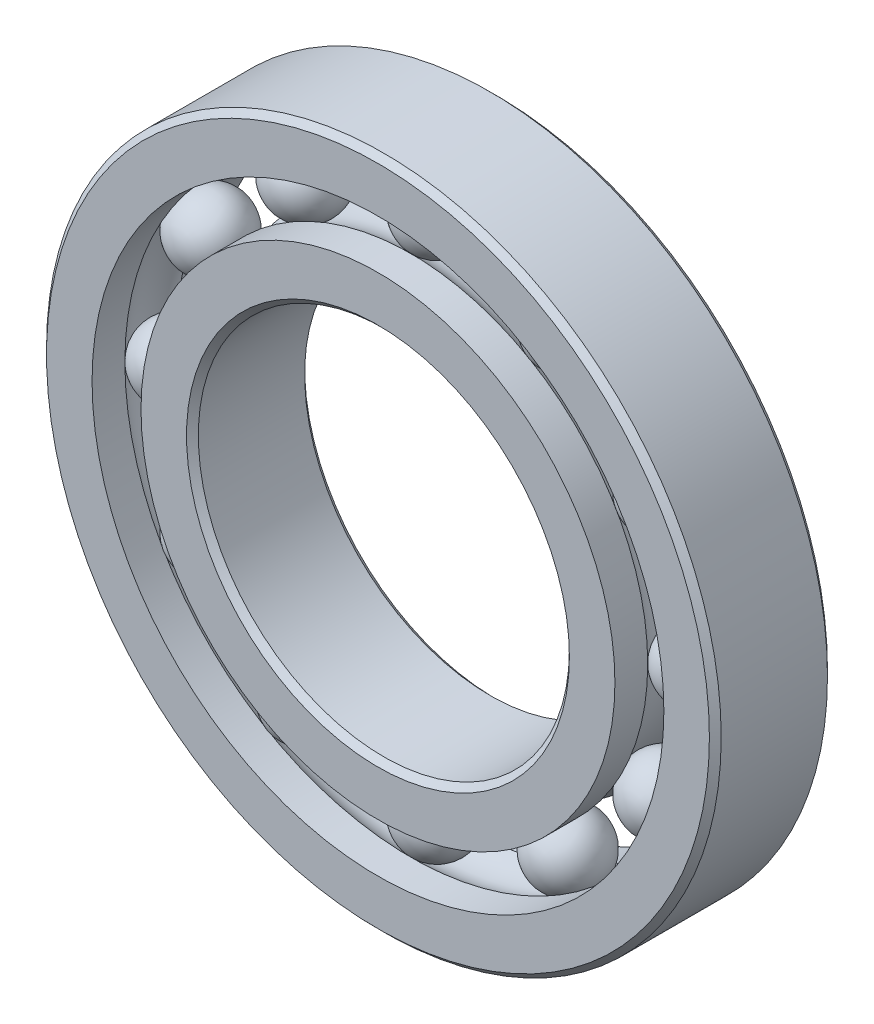
ISO-10303-21;
HEADER;
FILE_DESCRIPTION(('STEP AP214'),'2;1');
FILE_NAME('part.step','',(''),(''),'','','');
FILE_SCHEMA(('AUTOMOTIVE_DESIGN { 1 0 10303 214 1 1 1 1 }'));
ENDSEC;
DATA;
#1=APPLICATION_CONTEXT('core data for automotive mechanical design processes');
#2=APPLICATION_PROTOCOL_DEFINITION('international standard','automotive_design',2000,#1);
#3=PRODUCT_CONTEXT('',#1,'mechanical');
#4=PRODUCT('Part','Part','',(#3));
#5=PRODUCT_RELATED_PRODUCT_CATEGORY('part','',(#4));
#6=PRODUCT_DEFINITION_FORMATION('','',#4);
#7=PRODUCT_DEFINITION_CONTEXT('part definition',#1,'design');
#8=PRODUCT_DEFINITION('design','',#6,#7);
#9=PRODUCT_DEFINITION_SHAPE('','',#8);
#10=(LENGTH_UNIT() NAMED_UNIT(*) SI_UNIT(.MILLI.,.METRE.));
#11=(NAMED_UNIT(*) PLANE_ANGLE_UNIT() SI_UNIT($,.RADIAN.));
#12=(NAMED_UNIT(*) SI_UNIT($,.STERADIAN.) SOLID_ANGLE_UNIT());
#13=UNCERTAINTY_MEASURE_WITH_UNIT(LENGTH_MEASURE(1.E-05),#10,'distance_accuracy_value','');
#14=(GEOMETRIC_REPRESENTATION_CONTEXT(3) GLOBAL_UNCERTAINTY_ASSIGNED_CONTEXT((#13)) GLOBAL_UNIT_ASSIGNED_CONTEXT((#10,
#11,#12)) REPRESENTATION_CONTEXT('',''));
#15=CARTESIAN_POINT('',(0.,0.,0.));
#16=DIRECTION('',(0.,0.,1.));
#17=DIRECTION('',(1.,0.,0.));
#18=AXIS2_PLACEMENT_3D('',#15,#16,#17);
#19=CARTESIAN_POINT('',(-12.3031249999997,21.309637591871,0.));
#20=DIRECTION('',(0.,0.,1.));
#21=DIRECTION('',(-0.499999999999989,0.866025403784445,0.));
#22=AXIS2_PLACEMENT_3D('',#19,#20,#21);
#23=SPHERICAL_SURFACE('',#22,3.37650718557395);
#24=CARTESIAN_POINT('',(-12.3031249999997,21.309637591871,3.37650718557395));
#25=VERTEX_POINT('',#24);
#26=VERTEX_LOOP('',#25);
#27=FACE_BOUND('',#26,.T.);
#28=ADVANCED_FACE('F45',(#27),#23,.T.);
#29=CLOSED_SHELL('',(#28));
#30=MANIFOLD_SOLID_BREP('B2',#29);
#31=CARTESIAN_POINT('',(-21.3096375918707,12.3031250000002,0.));
#32=DIRECTION('',(0.,0.,1.));
#33=DIRECTION('',(-0.866025403784433,0.50000000000001,0.));
#34=AXIS2_PLACEMENT_3D('',#31,#32,#33);
#35=SPHERICAL_SURFACE('',#34,3.37650718557395);
#36=CARTESIAN_POINT('',(-21.3096375918707,12.3031250000002,3.37650718557395));
#37=VERTEX_POINT('',#36);
#38=VERTEX_LOOP('',#37);
#39=FACE_BOUND('',#38,.T.);
#40=ADVANCED_FACE('F67',(#39),#35,.T.);
#41=CLOSED_SHELL('',(#40));
#42=MANIFOLD_SOLID_BREP('B6',#41);
#43=CARTESIAN_POINT('',(-24.60625,2.57736788081727E-13,0.));
#44=DIRECTION('',(0.,0.,1.));
#45=DIRECTION('',(-1.,0.,0.));
#46=AXIS2_PLACEMENT_3D('',#43,#44,#45);
#47=SPHERICAL_SURFACE('',#46,3.37650718557395);
#48=CARTESIAN_POINT('',(-24.60625,2.57736788081727E-13,3.37650718557395));
#49=VERTEX_POINT('',#48);
#50=VERTEX_LOOP('',#49);
#51=FACE_BOUND('',#50,.T.);
#52=ADVANCED_FACE('F89',(#51),#47,.T.);
#53=CLOSED_SHELL('',(#52));
#54=MANIFOLD_SOLID_BREP('B41',#53);
#55=CARTESIAN_POINT('',(-21.309637591871,-12.3031249999998,0.));
#56=DIRECTION('',(0.,0.,1.));
#57=DIRECTION('',(-0.866025403784443,-0.499999999999992,0.));
#58=AXIS2_PLACEMENT_3D('',#55,#56,#57);
#59=SPHERICAL_SURFACE('',#58,3.37650718557395);
#60=CARTESIAN_POINT('',(-21.309637591871,-12.3031249999998,3.37650718557395));
#61=VERTEX_POINT('',#60);
#62=VERTEX_LOOP('',#61);
#63=FACE_BOUND('',#62,.T.);
#64=ADVANCED_FACE('F111',(#63),#59,.T.);
#65=CLOSED_SHELL('',(#64));
#66=MANIFOLD_SOLID_BREP('B63',#65);
#67=CARTESIAN_POINT('',(-12.3031250000002,-21.3096375918707,0.));
#68=DIRECTION('',(0.,0.,1.));
#69=DIRECTION('',(-0.500000000000007,-0.866025403784435,0.));
#70=AXIS2_PLACEMENT_3D('',#67,#68,#69);
#71=SPHERICAL_SURFACE('',#70,3.37650718557395);
#72=CARTESIAN_POINT('',(-12.3031250000002,-21.3096375918707,3.37650718557395));
#73=VERTEX_POINT('',#72);
#74=VERTEX_LOOP('',#73);
#75=FACE_BOUND('',#74,.T.);
#76=ADVANCED_FACE('F133',(#75),#71,.T.);
#77=CLOSED_SHELL('',(#76));
#78=MANIFOLD_SOLID_BREP('B85',#77);
#79=CARTESIAN_POINT('',(-1.71824525387818E-13,-24.60625,0.));
#80=DIRECTION('',(0.,0.,1.));
#81=DIRECTION('',(0.,-1.,0.));
#82=AXIS2_PLACEMENT_3D('',#79,#80,#81);
#83=SPHERICAL_SURFACE('',#82,3.37650718557395);
#84=CARTESIAN_POINT('',(-1.71824525387818E-13,-24.60625,3.37650718557395));
#85=VERTEX_POINT('',#84);
#86=VERTEX_LOOP('',#85);
#87=FACE_BOUND('',#86,.T.);
#88=ADVANCED_FACE('F155',(#87),#83,.T.);
#89=CLOSED_SHELL('',(#88));
#90=MANIFOLD_SOLID_BREP('B107',#89);
#91=CARTESIAN_POINT('',(12.3031249999999,-21.3096375918709,0.));
#92=DIRECTION('',(0.,0.,1.));
#93=DIRECTION('',(0.499999999999995,-0.866025403784442,0.));
#94=AXIS2_PLACEMENT_3D('',#91,#92,#93);
#95=SPHERICAL_SURFACE('',#94,3.37650718557395);
#96=CARTESIAN_POINT('',(12.3031249999999,-21.3096375918709,3.37650718557395));
#97=VERTEX_POINT('',#96);
#98=VERTEX_LOOP('',#97);
#99=FACE_BOUND('',#98,.T.);
#100=ADVANCED_FACE('F177',(#99),#95,.T.);
#101=CLOSED_SHELL('',(#100));
#102=MANIFOLD_SOLID_BREP('B129',#101);
#103=CARTESIAN_POINT('',(21.3096375918708,-12.3031250000001,0.));
#104=DIRECTION('',(0.,0.,1.));
#105=DIRECTION('',(0.866025403784436,-0.500000000000004,0.));
#106=AXIS2_PLACEMENT_3D('',#103,#104,#105);
#107=SPHERICAL_SURFACE('',#106,3.37650718557395);
#108=CARTESIAN_POINT('',(21.3096375918708,-12.3031250000001,3.37650718557395));
#109=VERTEX_POINT('',#108);
#110=VERTEX_LOOP('',#109);
#111=FACE_BOUND('',#110,.T.);
#112=ADVANCED_FACE('F199',(#111),#107,.T.);
#113=CLOSED_SHELL('',(#112));
#114=MANIFOLD_SOLID_BREP('B151',#113);
#115=CARTESIAN_POINT('',(24.60625,0.,0.));
#116=DIRECTION('',(0.,0.,1.));
#117=DIRECTION('',(1.,0.,0.));
#118=AXIS2_PLACEMENT_3D('',#115,#116,#117);
#119=SPHERICAL_SURFACE('',#118,3.37650718557395);
#120=CARTESIAN_POINT('',(24.60625,0.,3.37650718557395));
#121=VERTEX_POINT('',#120);
#122=VERTEX_LOOP('',#121);
#123=FACE_BOUND('',#122,.T.);
#124=ADVANCED_FACE('F221',(#123),#119,.T.);
#125=CLOSED_SHELL('',(#124));
#126=MANIFOLD_SOLID_BREP('B173',#125);
#127=CARTESIAN_POINT('',(21.3096375918709,12.303125,0.));
#128=DIRECTION('',(0.,0.,1.));
#129=DIRECTION('',(0.86602540378444,0.499999999999998,0.));
#130=AXIS2_PLACEMENT_3D('',#127,#128,#129);
#131=SPHERICAL_SURFACE('',#130,3.37650718557395);
#132=CARTESIAN_POINT('',(21.3096375918709,12.303125,3.37650718557395));
#133=VERTEX_POINT('',#132);
#134=VERTEX_LOOP('',#133);
#135=FACE_BOUND('',#134,.T.);
#136=ADVANCED_FACE('F243',(#135),#131,.T.);
#137=CLOSED_SHELL('',(#136));
#138=MANIFOLD_SOLID_BREP('B195',#137);
#139=CARTESIAN_POINT('',(12.303125,21.3096375918708,0.));
#140=DIRECTION('',(0.,0.,1.));
#141=DIRECTION('',(0.500000000000001,0.866025403784438,0.));
#142=AXIS2_PLACEMENT_3D('',#139,#140,#141);
#143=SPHERICAL_SURFACE('',#142,3.37650718557395);
#144=CARTESIAN_POINT('',(12.303125,21.3096375918708,3.37650718557395));
#145=VERTEX_POINT('',#144);
#146=VERTEX_LOOP('',#145);
#147=FACE_BOUND('',#146,.T.);
#148=ADVANCED_FACE('F265',(#147),#143,.T.);
#149=CLOSED_SHELL('',(#148));
#150=MANIFOLD_SOLID_BREP('B217',#149);
#151=CARTESIAN_POINT('',(0.,24.60625,0.));
#152=DIRECTION('',(0.,0.,1.));
#153=DIRECTION('',(0.,1.,0.));
#154=AXIS2_PLACEMENT_3D('',#151,#152,#153);
#155=SPHERICAL_SURFACE('',#154,3.37650718557395);
#156=CARTESIAN_POINT('',(0.,24.60625,3.37650718557395));
#157=VERTEX_POINT('',#156);
#158=VERTEX_LOOP('',#157);
#159=FACE_BOUND('',#158,.T.);
#160=ADVANCED_FACE('F289',(#159),#155,.T.);
#161=CLOSED_SHELL('',(#160));
#162=MANIFOLD_SOLID_BREP('B239',#161);
#163=CARTESIAN_POINT('',(0.,22.3035027472528,5.55625));
#164=DIRECTION('',(0.,0.,-1.));
#165=DIRECTION('',(-1.,0.,0.));
#166=AXIS2_PLACEMENT_3D('',#163,#164,#165);
#167=PLANE('',#166);
#168=CARTESIAN_POINT('',(0.,0.,5.55625));
#169=DIRECTION('',(0.,0.,1.));
#170=DIRECTION('',(1.,0.,0.));
#171=AXIS2_PLACEMENT_3D('',#168,#169,#170);
#172=CIRCLE('',#171,18.018125);
#173=CARTESIAN_POINT('',(18.018125,0.,5.55625));
#174=VERTEX_POINT('',#173);
#175=EDGE_CURVE('E338',#174,#174,#172,.T.);
#176=ORIENTED_EDGE('',*,*,#175,.F.);
#177=EDGE_LOOP('',(#176));
#178=FACE_BOUND('',#177,.T.);
#179=CARTESIAN_POINT('',(0.,0.,5.55625000000001));
#180=DIRECTION('',(0.,0.,1.));
#181=DIRECTION('',(1.,0.,0.));
#182=AXIS2_PLACEMENT_3D('',#179,#180,#181);
#183=CIRCLE('',#182,22.3035027472528);
#184=CARTESIAN_POINT('',(22.3035027472528,0.,5.55625000000001));
#185=VERTEX_POINT('',#184);
#186=EDGE_CURVE('E288',#185,#185,#183,.T.);
#187=ORIENTED_EDGE('',*,*,#186,.T.);
#188=EDGE_LOOP('',(#187));
#189=FACE_BOUND('',#188,.T.);
#190=ADVANCED_FACE('F310',(#178,#189),#167,.F.);
#191=CARTESIAN_POINT('',(0.,0.,5.55625));
#192=DIRECTION('',(0.,0.,1.));
#193=DIRECTION('',(1.,0.,0.));
#194=AXIS2_PLACEMENT_3D('',#191,#192,#193);
#195=CYLINDRICAL_SURFACE('',#194,22.3035027472528);
#196=ORIENTED_EDGE('',*,*,#186,.F.);
#197=EDGE_LOOP('',(#196));
#198=FACE_BOUND('',#197,.T.);
#199=CARTESIAN_POINT('',(0.,0.,2.46944444444444));
#200=DIRECTION('',(0.,0.,1.));
#201=DIRECTION('',(1.,0.,0.));
#202=AXIS2_PLACEMENT_3D('',#199,#200,#201);
#203=CIRCLE('',#202,22.3035027472528);
#204=CARTESIAN_POINT('',(22.3035027472528,0.,2.46944444444444));
#205=VERTEX_POINT('',#204);
#206=EDGE_CURVE('E316',#205,#205,#203,.T.);
#207=ORIENTED_EDGE('',*,*,#206,.T.);
#208=EDGE_LOOP('',(#207));
#209=FACE_BOUND('',#208,.T.);
#210=ADVANCED_FACE('F345',(#198,#209),#195,.T.);
#211=CARTESIAN_POINT('',(0.,0.,0.));
#212=DIRECTION('',(0.,0.,1.));
#213=DIRECTION('',(1.,0.,0.));
#214=AXIS2_PLACEMENT_3D('',#211,#212,#213);
#215=TOROIDAL_SURFACE('',#214,24.60625,3.37650718557395);
#216=ORIENTED_EDGE('',*,*,#206,.F.);
#217=EDGE_LOOP('',(#216));
#218=FACE_BOUND('',#217,.T.);
#219=CARTESIAN_POINT('',(0.,0.,-2.46944444444445));
#220=DIRECTION('',(0.,0.,1.));
#221=DIRECTION('',(1.,0.,0.));
#222=AXIS2_PLACEMENT_3D('',#219,#220,#221);
#223=CIRCLE('',#222,22.3035027472528);
#224=CARTESIAN_POINT('',(22.3035027472528,0.,-2.46944444444445));
#225=VERTEX_POINT('',#224);
#226=EDGE_CURVE('E320',#225,#225,#223,.T.);
#227=ORIENTED_EDGE('',*,*,#226,.T.);
#228=EDGE_LOOP('',(#227));
#229=FACE_BOUND('',#228,.T.);
#230=ADVANCED_FACE('F349',(#218,#229),#215,.F.);
#231=CARTESIAN_POINT('',(0.,0.,5.55625));
#232=DIRECTION('',(0.,0.,1.));
#233=DIRECTION('',(1.,0.,0.));
#234=AXIS2_PLACEMENT_3D('',#231,#232,#233);
#235=CYLINDRICAL_SURFACE('',#234,22.3035027472528);
#236=ORIENTED_EDGE('',*,*,#226,.F.);
#237=EDGE_LOOP('',(#236));
#238=FACE_BOUND('',#237,.T.);
#239=CARTESIAN_POINT('',(0.,0.,-5.55625));
#240=DIRECTION('',(0.,0.,1.));
#241=DIRECTION('',(1.,0.,0.));
#242=AXIS2_PLACEMENT_3D('',#239,#240,#241);
#243=CIRCLE('',#242,22.3035027472528);
#244=CARTESIAN_POINT('',(22.3035027472528,0.,-5.55625));
#245=VERTEX_POINT('',#244);
#246=EDGE_CURVE('E324',#245,#245,#243,.T.);
#247=ORIENTED_EDGE('',*,*,#246,.T.);
#248=EDGE_LOOP('',(#247));
#249=FACE_BOUND('',#248,.T.);
#250=ADVANCED_FACE('F354',(#238,#249),#235,.T.);
#251=CARTESIAN_POINT('',(0.,18.018125,-5.55625000000001));
#252=DIRECTION('',(0.,0.,1.));
#253=DIRECTION('',(1.,0.,0.));
#254=AXIS2_PLACEMENT_3D('',#251,#252,#253);
#255=PLANE('',#254);
#256=ORIENTED_EDGE('',*,*,#246,.F.);
#257=EDGE_LOOP('',(#256));
#258=FACE_BOUND('',#257,.T.);
#259=CARTESIAN_POINT('',(0.,0.,-5.55625));
#260=DIRECTION('',(0.,0.,1.));
#261=DIRECTION('',(1.,0.,0.));
#262=AXIS2_PLACEMENT_3D('',#259,#260,#261);
#263=CIRCLE('',#262,18.018125);
#264=CARTESIAN_POINT('',(18.018125,0.,-5.55625));
#265=VERTEX_POINT('',#264);
#266=EDGE_CURVE('E329',#265,#265,#263,.T.);
#267=ORIENTED_EDGE('',*,*,#266,.T.);
#268=EDGE_LOOP('',(#267));
#269=FACE_BOUND('',#268,.T.);
#270=ADVANCED_FACE('F360',(#258,#269),#255,.F.);
#271=CARTESIAN_POINT('',(0.,0.,-5.000625));
#272=DIRECTION('',(0.,0.,-1.));
#273=DIRECTION('',(-1.,0.,0.));
#274=AXIS2_PLACEMENT_3D('',#271,#272,#273);
#275=CONICAL_SURFACE('',#274,17.4625,0.785398163397445);
#276=ORIENTED_EDGE('',*,*,#266,.F.);
#277=EDGE_LOOP('',(#276));
#278=FACE_BOUND('',#277,.T.);
#279=CARTESIAN_POINT('',(0.,0.,-5.000625));
#280=DIRECTION('',(0.,0.,1.));
#281=DIRECTION('',(1.,0.,0.));
#282=AXIS2_PLACEMENT_3D('',#279,#280,#281);
#283=CIRCLE('',#282,17.4625);
#284=CARTESIAN_POINT('',(17.4625,0.,-5.000625));
#285=VERTEX_POINT('',#284);
#286=EDGE_CURVE('E332',#285,#285,#283,.T.);
#287=ORIENTED_EDGE('',*,*,#286,.T.);
#288=EDGE_LOOP('',(#287));
#289=FACE_BOUND('',#288,.T.);
#290=ADVANCED_FACE('F364',(#278,#289),#275,.F.);
#291=CARTESIAN_POINT('',(0.,0.,5.55625));
#292=DIRECTION('',(0.,0.,1.));
#293=DIRECTION('',(1.,0.,0.));
#294=AXIS2_PLACEMENT_3D('',#291,#292,#293);
#295=CYLINDRICAL_SURFACE('',#294,17.4625);
#296=ORIENTED_EDGE('',*,*,#286,.F.);
#297=EDGE_LOOP('',(#296));
#298=FACE_BOUND('',#297,.T.);
#299=CARTESIAN_POINT('',(0.,0.,5.000625));
#300=DIRECTION('',(0.,0.,1.));
#301=DIRECTION('',(1.,0.,0.));
#302=AXIS2_PLACEMENT_3D('',#299,#300,#301);
#303=CIRCLE('',#302,17.4625);
#304=CARTESIAN_POINT('',(17.4625,0.,5.000625));
#305=VERTEX_POINT('',#304);
#306=EDGE_CURVE('E335',#305,#305,#303,.T.);
#307=ORIENTED_EDGE('',*,*,#306,.T.);
#308=EDGE_LOOP('',(#307));
#309=FACE_BOUND('',#308,.T.);
#310=ADVANCED_FACE('F368',(#298,#309),#295,.F.);
#311=CARTESIAN_POINT('',(0.,0.,5.55625));
#312=DIRECTION('',(0.,0.,1.));
#313=DIRECTION('',(1.,0.,0.));
#314=AXIS2_PLACEMENT_3D('',#311,#312,#313);
#315=CONICAL_SURFACE('',#314,18.018125,0.78539816339745);
#316=ORIENTED_EDGE('',*,*,#306,.F.);
#317=EDGE_LOOP('',(#316));
#318=FACE_BOUND('',#317,.T.);
#319=ORIENTED_EDGE('',*,*,#175,.T.);
#320=EDGE_LOOP('',(#319));
#321=FACE_BOUND('',#320,.T.);
#322=ADVANCED_FACE('F342',(#318,#321),#315,.F.);
#323=CLOSED_SHELL('',(#190,#210,#230,#250,#270,#290,#310,#322));
#324=MANIFOLD_SOLID_BREP('B261',#323);
#325=CARTESIAN_POINT('',(0.,0.,5.000625));
#326=DIRECTION('',(0.,0.,-1.));
#327=DIRECTION('',(-1.,0.,0.));
#328=AXIS2_PLACEMENT_3D('',#325,#326,#327);
#329=CONICAL_SURFACE('',#328,31.75,0.785398163397446);
#330=CARTESIAN_POINT('',(0.,0.,5.55625));
#331=DIRECTION('',(0.,0.,1.));
#332=DIRECTION('',(1.,0.,0.));
#333=AXIS2_PLACEMENT_3D('',#330,#331,#332);
#334=CIRCLE('',#333,31.194375);
#335=CARTESIAN_POINT('',(31.194375,0.,5.55625));
#336=VERTEX_POINT('',#335);
#337=EDGE_CURVE('E482',#336,#336,#334,.T.);
#338=ORIENTED_EDGE('',*,*,#337,.F.);
#339=EDGE_LOOP('',(#338));
#340=FACE_BOUND('',#339,.T.);
#341=CARTESIAN_POINT('',(0.,0.,5.000625));
#342=DIRECTION('',(0.,0.,1.));
#343=DIRECTION('',(1.,0.,0.));
#344=AXIS2_PLACEMENT_3D('',#341,#342,#343);
#345=CIRCLE('',#344,31.75);
#346=CARTESIAN_POINT('',(31.75,0.,5.000625));
#347=VERTEX_POINT('',#346);
#348=EDGE_CURVE('E309',#347,#347,#345,.T.);
#349=ORIENTED_EDGE('',*,*,#348,.T.);
#350=EDGE_LOOP('',(#349));
#351=FACE_BOUND('',#350,.T.);
#352=ADVANCED_FACE('F447',(#340,#351),#329,.T.);
#353=CARTESIAN_POINT('',(0.,0.,5.55625));
#354=DIRECTION('',(0.,0.,1.));
#355=DIRECTION('',(1.,0.,0.));
#356=AXIS2_PLACEMENT_3D('',#353,#354,#355);
#357=CYLINDRICAL_SURFACE('',#356,31.75);
#358=ORIENTED_EDGE('',*,*,#348,.F.);
#359=EDGE_LOOP('',(#358));
#360=FACE_BOUND('',#359,.T.);
#361=CARTESIAN_POINT('',(0.,0.,-5.000625));
#362=DIRECTION('',(0.,0.,1.));
#363=DIRECTION('',(1.,0.,0.));
#364=AXIS2_PLACEMENT_3D('',#361,#362,#363);
#365=CIRCLE('',#364,31.75);
#366=CARTESIAN_POINT('',(31.75,0.,-5.000625));
#367=VERTEX_POINT('',#366);
#368=EDGE_CURVE('E454',#367,#367,#365,.T.);
#369=ORIENTED_EDGE('',*,*,#368,.T.);
#370=EDGE_LOOP('',(#369));
#371=FACE_BOUND('',#370,.T.);
#372=ADVANCED_FACE('F490',(#360,#371),#357,.T.);
#373=CARTESIAN_POINT('',(0.,0.,-5.55625));
#374=DIRECTION('',(0.,0.,1.));
#375=DIRECTION('',(1.,0.,0.));
#376=AXIS2_PLACEMENT_3D('',#373,#374,#375);
#377=CONICAL_SURFACE('',#376,31.194375,0.785398163397445);
#378=ORIENTED_EDGE('',*,*,#368,.F.);
#379=EDGE_LOOP('',(#378));
#380=FACE_BOUND('',#379,.T.);
#381=CARTESIAN_POINT('',(0.,0.,-5.55625));
#382=DIRECTION('',(0.,0.,1.));
#383=DIRECTION('',(1.,0.,0.));
#384=AXIS2_PLACEMENT_3D('',#381,#382,#383);
#385=CIRCLE('',#384,31.194375);
#386=CARTESIAN_POINT('',(31.194375,0.,-5.55625));
#387=VERTEX_POINT('',#386);
#388=EDGE_CURVE('E459',#387,#387,#385,.T.);
#389=ORIENTED_EDGE('',*,*,#388,.T.);
#390=EDGE_LOOP('',(#389));
#391=FACE_BOUND('',#390,.T.);
#392=ADVANCED_FACE('F494',(#380,#391),#377,.T.);
#393=CARTESIAN_POINT('',(0.,31.194375,-5.55625));
#394=DIRECTION('',(0.,0.,1.));
#395=DIRECTION('',(1.,0.,0.));
#396=AXIS2_PLACEMENT_3D('',#393,#394,#395);
#397=PLANE('',#396);
#398=ORIENTED_EDGE('',*,*,#388,.F.);
#399=EDGE_LOOP('',(#398));
#400=FACE_BOUND('',#399,.T.);
#401=CARTESIAN_POINT('',(0.,0.,-5.55625));
#402=DIRECTION('',(0.,0.,1.));
#403=DIRECTION('',(1.,0.,0.));
#404=AXIS2_PLACEMENT_3D('',#401,#402,#403);
#405=CIRCLE('',#404,26.9089972527473);
#406=CARTESIAN_POINT('',(26.9089972527473,0.,-5.55625));
#407=VERTEX_POINT('',#406);
#408=EDGE_CURVE('E464',#407,#407,#405,.T.);
#409=ORIENTED_EDGE('',*,*,#408,.T.);
#410=EDGE_LOOP('',(#409));
#411=FACE_BOUND('',#410,.T.);
#412=ADVANCED_FACE('F499',(#400,#411),#397,.F.);
#413=CARTESIAN_POINT('',(0.,0.,5.55625));
#414=DIRECTION('',(0.,0.,1.));
#415=DIRECTION('',(1.,0.,0.));
#416=AXIS2_PLACEMENT_3D('',#413,#414,#415);
#417=CYLINDRICAL_SURFACE('',#416,26.9089972527473);
#418=ORIENTED_EDGE('',*,*,#408,.F.);
#419=EDGE_LOOP('',(#418));
#420=FACE_BOUND('',#419,.T.);
#421=CARTESIAN_POINT('',(0.,0.,-2.46944444444444));
#422=DIRECTION('',(0.,0.,1.));
#423=DIRECTION('',(1.,0.,0.));
#424=AXIS2_PLACEMENT_3D('',#421,#422,#423);
#425=CIRCLE('',#424,26.9089972527473);
#426=CARTESIAN_POINT('',(26.9089972527473,0.,-2.46944444444444));
#427=VERTEX_POINT('',#426);
#428=EDGE_CURVE('E470',#427,#427,#425,.T.);
#429=ORIENTED_EDGE('',*,*,#428,.T.);
#430=EDGE_LOOP('',(#429));
#431=FACE_BOUND('',#430,.T.);
#432=ADVANCED_FACE('F505',(#420,#431),#417,.F.);
#433=CARTESIAN_POINT('',(0.,0.,0.));
#434=DIRECTION('',(0.,0.,1.));
#435=DIRECTION('',(1.,0.,0.));
#436=AXIS2_PLACEMENT_3D('',#433,#434,#435);
#437=TOROIDAL_SURFACE('',#436,24.60625,3.37650718557395);
#438=ORIENTED_EDGE('',*,*,#428,.F.);
#439=EDGE_LOOP('',(#438));
#440=FACE_BOUND('',#439,.T.);
#441=CARTESIAN_POINT('',(0.,0.,2.46944444444444));
#442=DIRECTION('',(0.,0.,1.));
#443=DIRECTION('',(1.,0.,0.));
#444=AXIS2_PLACEMENT_3D('',#441,#442,#443);
#445=CIRCLE('',#444,26.9089972527473);
#446=CARTESIAN_POINT('',(26.9089972527473,0.,2.46944444444444));
#447=VERTEX_POINT('',#446);
#448=EDGE_CURVE('E474',#447,#447,#445,.T.);
#449=ORIENTED_EDGE('',*,*,#448,.T.);
#450=EDGE_LOOP('',(#449));
#451=FACE_BOUND('',#450,.T.);
#452=ADVANCED_FACE('F509',(#440,#451),#437,.F.);
#453=CARTESIAN_POINT('',(0.,0.,5.55625));
#454=DIRECTION('',(0.,0.,1.));
#455=DIRECTION('',(1.,0.,0.));
#456=AXIS2_PLACEMENT_3D('',#453,#454,#455);
#457=CYLINDRICAL_SURFACE('',#456,26.9089972527473);
#458=ORIENTED_EDGE('',*,*,#448,.F.);
#459=EDGE_LOOP('',(#458));
#460=FACE_BOUND('',#459,.T.);
#461=CARTESIAN_POINT('',(0.,0.,5.55625));
#462=DIRECTION('',(0.,0.,1.));
#463=DIRECTION('',(1.,0.,0.));
#464=AXIS2_PLACEMENT_3D('',#461,#462,#463);
#465=CIRCLE('',#464,26.9089972527473);
#466=CARTESIAN_POINT('',(26.9089972527473,0.,5.55625));
#467=VERTEX_POINT('',#466);
#468=EDGE_CURVE('E478',#467,#467,#465,.T.);
#469=ORIENTED_EDGE('',*,*,#468,.T.);
#470=EDGE_LOOP('',(#469));
#471=FACE_BOUND('',#470,.T.);
#472=ADVANCED_FACE('F513',(#460,#471),#457,.F.);
#473=CARTESIAN_POINT('',(0.,31.194375,5.55625));
#474=DIRECTION('',(0.,0.,-1.));
#475=DIRECTION('',(-1.,0.,0.));
#476=AXIS2_PLACEMENT_3D('',#473,#474,#475);
#477=PLANE('',#476);
#478=ORIENTED_EDGE('',*,*,#468,.F.);
#479=EDGE_LOOP('',(#478));
#480=FACE_BOUND('',#479,.T.);
#481=ORIENTED_EDGE('',*,*,#337,.T.);
#482=EDGE_LOOP('',(#481));
#483=FACE_BOUND('',#482,.T.);
#484=ADVANCED_FACE('F487',(#480,#483),#477,.F.);
#485=CLOSED_SHELL('',(#352,#372,#392,#412,#432,#452,#472,#484));
#486=MANIFOLD_SOLID_BREP('B283',#485);
#487=ADVANCED_BREP_SHAPE_REPRESENTATION('',(#18,#30,#42,#54,#66,#78,#90,#102,#114,#126,#138,
#150,#162,#324,#486),#14);
#488=SHAPE_DEFINITION_REPRESENTATION(#9,#487);
ENDSEC;
END-ISO-10303-21;
